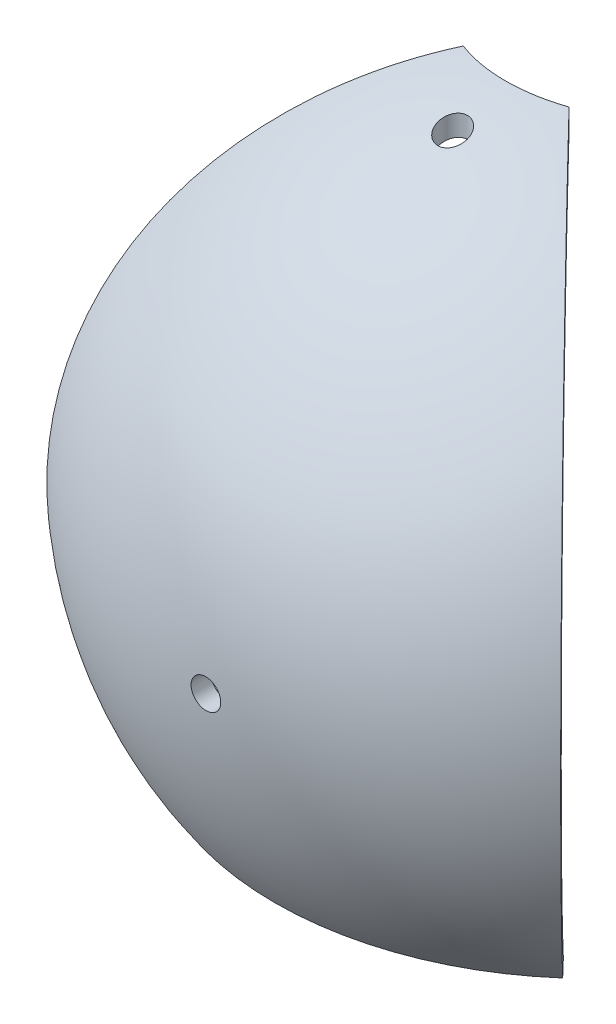
ISO-10303-21;
HEADER;
FILE_DESCRIPTION(('STEP AP214'),'2;1');
FILE_NAME('part.step','',(''),(''),'','','');
FILE_SCHEMA(('AUTOMOTIVE_DESIGN { 1 0 10303 214 1 1 1 1 }'));
ENDSEC;
DATA;
#1=APPLICATION_CONTEXT('core data for automotive mechanical design processes');
#2=APPLICATION_PROTOCOL_DEFINITION('international standard','automotive_design',2000,#1);
#3=PRODUCT_CONTEXT('',#1,'mechanical');
#4=PRODUCT('Part','Part','',(#3));
#5=PRODUCT_RELATED_PRODUCT_CATEGORY('part','',(#4));
#6=PRODUCT_DEFINITION_FORMATION('','',#4);
#7=PRODUCT_DEFINITION_CONTEXT('part definition',#1,'design');
#8=PRODUCT_DEFINITION('design','',#6,#7);
#9=PRODUCT_DEFINITION_SHAPE('','',#8);
#10=(LENGTH_UNIT() NAMED_UNIT(*) SI_UNIT(.MILLI.,.METRE.));
#11=(NAMED_UNIT(*) PLANE_ANGLE_UNIT() SI_UNIT($,.RADIAN.));
#12=(NAMED_UNIT(*) SI_UNIT($,.STERADIAN.) SOLID_ANGLE_UNIT());
#13=UNCERTAINTY_MEASURE_WITH_UNIT(LENGTH_MEASURE(1.E-05),#10,'distance_accuracy_value','');
#14=(GEOMETRIC_REPRESENTATION_CONTEXT(3) GLOBAL_UNCERTAINTY_ASSIGNED_CONTEXT((#13)) GLOBAL_UNIT_ASSIGNED_CONTEXT((#10,
#11,#12)) REPRESENTATION_CONTEXT('',''));
#15=CARTESIAN_POINT('',(0.,0.,0.));
#16=DIRECTION('',(0.,0.,1.));
#17=DIRECTION('',(1.,0.,0.));
#18=AXIS2_PLACEMENT_3D('',#15,#16,#17);
#19=CARTESIAN_POINT('',(0.,0.,0.));
#20=DIRECTION('',(0.,1.,0.));
#21=DIRECTION('',(1.,0.,0.));
#22=AXIS2_PLACEMENT_3D('',#19,#20,#21);
#23=SPHERICAL_SURFACE('',#22,39.);
#24=CARTESIAN_POINT('',(-0.829317384446339,-1.74989275082327,38.9518945311625));
#25=CARTESIAN_POINT('',(-0.759113662667595,-1.7964691191582,38.9512965972717));
#26=CARTESIAN_POINT('',(-0.684925455090101,-1.83715175361978,38.9507745988475));
#27=CARTESIAN_POINT('',(-0.530708817745456,-1.90551726469634,38.9498971700714));
#28=CARTESIAN_POINT('',(-0.450673467904894,-1.93318443990475,38.9495419409053));
#29=CARTESIAN_POINT('',(-0.287123645697143,-1.97467653061984,38.9490092526865));
#30=CARTESIAN_POINT('',(-0.203610844476173,-1.98850801692015,38.9488317092478));
#31=CARTESIAN_POINT('',(-0.0354711783529405,-2.00195010621267,38.9486591601945));
#32=CARTESIAN_POINT('',(0.0491554048302957,-2.00156423876038,38.9486641092748));
#33=CARTESIAN_POINT('',(0.217149879164021,-1.98659263391192,38.9488563021904));
#34=CARTESIAN_POINT('',(0.300517673022089,-1.97200580456416,38.9490435600441));
#35=CARTESIAN_POINT('',(0.463624042350791,-1.92904356400015,38.9495950755504));
#36=CARTESIAN_POINT('',(0.543362475604774,-1.90066761296442,38.9499593401326));
#37=CARTESIAN_POINT('',(0.696942919628291,-1.8309331130855,38.9508545102239));
#38=CARTESIAN_POINT('',(0.770784967717642,-1.78957464642033,38.9513854146783));
#39=CARTESIAN_POINT('',(0.910477302840745,-1.6950495057598,38.9525987690921));
#40=CARTESIAN_POINT('',(0.976327603636761,-1.64188285209927,38.9532812187906));
#41=CARTESIAN_POINT('',(1.09817172173922,-1.5252471737738,38.95477831261));
#42=CARTESIAN_POINT('',(1.15416493660856,-1.46177751987408,38.9555929648049));
#43=CARTESIAN_POINT('',(1.25470102366707,-1.32634014555662,38.9573312819483));
#44=CARTESIAN_POINT('',(1.29924391161336,-1.2543724368335,38.9582549467467));
#45=CARTESIAN_POINT('',(1.3756188186184,-1.1039755945865,38.960185129638));
#46=CARTESIAN_POINT('',(1.40744981372504,-1.02554594116191,38.9611916543974));
#47=CARTESIAN_POINT('',(1.45749272999841,-0.864456430275049,38.9632589068215));
#48=CARTESIAN_POINT('',(1.47570463124064,-0.78179656662424,38.9643196345655));
#49=CARTESIAN_POINT('',(1.49799336616795,-0.61458736372391,38.966465246246));
#50=CARTESIAN_POINT('',(1.50206927195666,-0.530037900806416,38.9675501317635));
#51=CARTESIAN_POINT('',(1.49596777940234,-0.361454778340608,38.9697131936351));
#52=CARTESIAN_POINT('',(1.48579038391762,-0.277421118688859,38.9707913699906));
#53=CARTESIAN_POINT('',(1.45147064891636,-0.112253046204455,38.9729104388805));
#54=CARTESIAN_POINT('',(1.42732798814376,-0.0311187001130125,38.9739513305568));
#55=CARTESIAN_POINT('',(1.36576251642206,0.125945368268407,38.9759662662382));
#56=CARTESIAN_POINT('',(1.32833970489738,0.201875090332812,38.9769403102403));
#57=CARTESIAN_POINT('',(1.24127725272952,0.346371883209455,38.9787938851804));
#58=CARTESIAN_POINT('',(1.19163798184242,0.414939176770419,38.9796734189779));
#59=CARTESIAN_POINT('',(1.08155083962351,0.542766772028414,38.9813130544399));
#60=CARTESIAN_POINT('',(1.02110297245977,0.602027077314427,38.9820731561505));
#61=CARTESIAN_POINT('',(0.891119045328867,0.709553973550744,38.9834523156998));
#62=CARTESIAN_POINT('',(0.821583622144255,0.757821334148481,38.9840713834126));
#63=CARTESIAN_POINT('',(0.675395145603105,0.841996845823652,38.9851509826645));
#64=CARTESIAN_POINT('',(0.598742095089817,0.877905001838139,38.9856115142669));
#65=CARTESIAN_POINT('',(0.440500838918119,0.936339856762202,38.9863609483892));
#66=CARTESIAN_POINT('',(0.35891302415653,0.95886761404594,38.9866498644838));
#67=CARTESIAN_POINT('',(0.193112947691494,0.989906254260217,38.9870479300126));
#68=CARTESIAN_POINT('',(0.108900687259288,0.998417143980205,38.9871570795339));
#69=CARTESIAN_POINT('',(-0.0597529230804632,1.00118024521994,38.9871925155631));
#70=CARTESIAN_POINT('',(-0.144194260432133,0.995433223060434,38.9871188118989));
#71=CARTESIAN_POINT('',(-0.310913492189501,0.969845336114689,38.9867906522879));
#72=CARTESIAN_POINT('',(-0.393191385953802,0.950004467150089,38.9865361962876));
#73=CARTESIAN_POINT('',(-0.553247795669495,0.896792483018353,38.9858537497718));
#74=CARTESIAN_POINT('',(-0.631026330878122,0.86342142576526,38.9854257599991));
#75=CARTESIAN_POINT('',(-0.779876741266382,0.784096755666778,38.9844083835567));
#76=CARTESIAN_POINT('',(-0.850948622283326,0.738143153773069,38.9838189970276));
#77=CARTESIAN_POINT('',(-0.984371928218104,0.634955764713508,38.9824955101811));
#78=CARTESIAN_POINT('',(-1.0467229515231,0.577721458341001,38.9817614032029));
#79=CARTESIAN_POINT('',(-1.16093142914819,0.453598835335737,38.9801693104379));
#80=CARTESIAN_POINT('',(-1.21278886041956,0.386710497498862,38.9793113243789));
#81=CARTESIAN_POINT('',(-1.30454212809818,0.245173289505732,38.9774957393664));
#82=CARTESIAN_POINT('',(-1.34443706462224,0.170523836085196,38.9765381329262));
#83=CARTESIAN_POINT('',(-1.41112822365136,0.0155874327516109,38.9745505223784));
#84=CARTESIAN_POINT('',(-1.43792441403325,-0.0646995309862279,38.9735205180932));
#85=CARTESIAN_POINT('',(-1.47765964571755,-0.228639595189733,38.9714172376562));
#86=CARTESIAN_POINT('',(-1.49059740226104,-0.312293006999318,38.970343957502));
#87=CARTESIAN_POINT('',(-1.50224387312748,-0.48058118497398,38.968184714985));
#88=CARTESIAN_POINT('',(-1.50095314230701,-0.565215912742917,38.9670987531182));
#89=CARTESIAN_POINT('',(-1.48418178002425,-0.733061634951191,38.9649450087684));
#90=CARTESIAN_POINT('',(-1.46870208629033,-0.816272723106649,38.9638772250888));
#91=CARTESIAN_POINT('',(-1.42398537187875,-0.978937481310493,38.9617897890118));
#92=CARTESIAN_POINT('',(-1.39474493201641,-1.05839021210282,38.9607701486462));
#93=CARTESIAN_POINT('',(-1.32332721513536,-1.21128841156768,38.9588078966232));
#94=CARTESIAN_POINT('',(-1.28114394607499,-1.28473107781629,38.9578653209004));
#95=CARTESIAN_POINT('',(-1.18506981383644,-1.42342281433127,38.956085241798));
#96=CARTESIAN_POINT('',(-1.13119309955581,-1.48868163766003,38.955247613349));
#97=CARTESIAN_POINT('',(-1.03544664427015,-1.58656832111288,38.9539912380819));
#98=CARTESIAN_POINT('',(-0.996651447364394,-1.62225534180965,38.9535332076529));
#99=CARTESIAN_POINT('',(-0.915528938893831,-1.68936014749848,38.9526717379846));
#100=CARTESIAN_POINT('',(-0.873201626912583,-1.72077793198719,38.9522682987517));
#101=CARTESIAN_POINT('',(-0.829317384446339,-1.74989275082327,38.9518945311625));
#102=B_SPLINE_CURVE_WITH_KNOTS('',3,(#24,#25,#26,#27,#28,#29,#30,#31,#32,#33,#34,#35,#36,#37,
#38,#39,#40,#41,#42,#43,#44,#45,#46,#47,#48,#49,#50,#51,#52,#53,#54,#55,#56,#57,#58,#59,#60,#61,
#62,#63,#64,#65,#66,#67,#68,#69,#70,#71,#72,#73,#74,#75,#76,#77,#78,#79,#80,#81,#82,#83,#84,#85,
#86,#87,#88,#89,#90,#91,#92,#93,#94,#95,#96,#97,#98,#99,#100,#101),.UNSPECIFIED.,.T.,.F.,(4,2,2,
2,2,2,2,2,2,2,2,2,2,2,2,2,2,2,2,2,2,2,2,2,2,2,2,2,2,2,2,2,2,2,2,2,2,2,4),(0.,0.25256159699522,
0.5054270992835,0.758172454536491,1.01085506444582,1.26355710536095,1.51626903990663,
1.76897937484332,2.02168927459163,2.27441461389333,2.52713960541053,2.77988495000335,
3.03263066435732,3.28539296879802,3.53815522255051,3.79092329106083,4.04369137052627,
4.29645180039056,4.54921213278455,4.80195476326245,5.05469729277874,5.30741982798813,
5.56014224078451,5.81285107079031,6.06555997571602,6.31826779896867,6.57097540226845,
6.8236946394269,7.0764144316664,7.32915323008112,7.58189264830538,7.83465549494382,
8.08740848483296,8.34014477184077,8.59294389037399,8.84586022241016,9.09847221870165,
9.25634808016043,9.41422396023315),.UNSPECIFIED.);
#103=CARTESIAN_POINT('',(-0.829317384446339,-1.74989275082327,38.9518945311625));
#104=VERTEX_POINT('',#103);
#105=EDGE_CURVE('E97',#104,#104,#102,.T.);
#106=ORIENTED_EDGE('',*,*,#105,.F.);
#107=EDGE_LOOP('',(#106));
#108=FACE_BOUND('',#107,.T.);
#109=CARTESIAN_POINT('',(-5.34808023640383,37.8830921170535,7.56765283531336));
#110=CARTESIAN_POINT('',(-4.99209576801475,37.9036155476832,7.71656461083798));
#111=CARTESIAN_POINT('',(-4.62976325002011,37.9220698612105,7.85057549590869));
#112=CARTESIAN_POINT('',(-3.89501451804352,37.954742893749,8.08797682705822));
#113=CARTESIAN_POINT('',(-3.52259827120587,37.9689615989576,8.19136717335339));
#114=CARTESIAN_POINT('',(-2.77010534819923,37.9930720550301,8.36675241885814));
#115=CARTESIAN_POINT('',(-2.39002486877698,38.0029615994443,8.43873130848632));
#116=CARTESIAN_POINT('',(-1.62511210631183,38.0183403517788,8.55068671495762));
#117=CARTESIAN_POINT('',(-1.24028007576623,38.0238297925073,8.59066492494714));
#118=CARTESIAN_POINT('',(-0.468275058208203,38.0303759177944,8.63834065389105));
#119=CARTESIAN_POINT('',(-0.0811004461248224,38.0314290562428,8.64601234898124));
#120=CARTESIAN_POINT('',(0.692520557457719,38.0290860414442,8.62894665418871));
#121=CARTESIAN_POINT('',(1.07896695183712,38.0256899058321,8.60420939276008));
#122=CARTESIAN_POINT('',(1.84772963948812,38.0144800364282,8.52258255975344));
#123=CARTESIAN_POINT('',(2.23005170848019,38.0066736213385,8.46574625544929));
#124=CARTESIAN_POINT('',(2.9883602406237,37.9867021161635,8.32040937417763));
#125=CARTESIAN_POINT('',(3.3643494866971,37.9745389958542,8.23192310697918));
#126=CARTESIAN_POINT('',(4.01028166406886,37.9496751232212,8.05115693329916));
#127=CARTESIAN_POINT('',(4.2822546207514,37.9379459487579,7.96591447783717));
#128=CARTESIAN_POINT('',(4.81997787484041,37.9122137786293,7.77900955907756));
#129=CARTESIAN_POINT('',(5.08573605039015,37.8982138627542,7.67736933693509));
#130=CARTESIAN_POINT('',(5.34808023640385,37.8830921170535,7.56765283531337));
#131=B_SPLINE_CURVE_WITH_KNOTS('',3,(#109,#110,#111,#112,#113,#114,#115,#116,#117,#118,#119,
#120,#121,#122,#123,#124,#125,#126,#127,#128,#129,#130),.UNSPECIFIED.,.F.,.F.,(4,2,2,2,2,2,2,2,
2,2,4),(0.,1.15891553536544,2.31783484726638,3.47734414152722,4.63679208244159,5.79716663984775,
6.95753659808005,8.1159865960024,9.27391348932759,10.1291691514563,10.9832743899857),.UNSPECIFIED.);
#132=CARTESIAN_POINT('',(-5.34788023640383,37.88310364409,7.56773646926302));
#133=VERTEX_POINT('',#132);
#134=CARTESIAN_POINT('',(5.34788023640385,37.88310364409,7.56773646926302));
#135=VERTEX_POINT('',#134);
#136=EDGE_CURVE('E127',#133,#135,#131,.T.);
#137=ORIENTED_EDGE('',*,*,#136,.F.);
#138=CARTESIAN_POINT('',(0.999188973849464,0.,0.959733456348281));
#139=DIRECTION('',(0.721202656557683,0.,0.692724135694824));
#140=DIRECTION('',(0.692724135694824,0.,-0.721202656557683));
#141=AXIS2_PLACEMENT_3D('',#138,#139,#140);
#142=CIRCLE('',#141,38.9753836810788);
#143=CARTESIAN_POINT('',(-21.1218911748245,-22.3457940451349,23.9902313805283));
#144=VERTEX_POINT('',#143);
#145=EDGE_CURVE('E95',#144,#133,#142,.F.);
#146=ORIENTED_EDGE('',*,*,#145,.F.);
#147=CARTESIAN_POINT('',(0.,-22.3457940451349,0.));
#148=DIRECTION('',(0.,1.,0.));
#149=DIRECTION('',(0.,0.,1.));
#150=AXIS2_PLACEMENT_3D('',#147,#148,#149);
#151=CIRCLE('',#150,31.9635024440754);
#152=CARTESIAN_POINT('',(21.1218911748245,-22.3457940451349,23.9902313805283));
#153=VERTEX_POINT('',#152);
#154=EDGE_CURVE('E103',#153,#144,#151,.F.);
#155=ORIENTED_EDGE('',*,*,#154,.F.);
#156=CARTESIAN_POINT('',(-0.999188973849462,0.,0.959733456348281));
#157=DIRECTION('',(-0.721202656557683,0.,0.692724135694824));
#158=DIRECTION('',(0.692724135694824,0.,0.721202656557683));
#159=AXIS2_PLACEMENT_3D('',#156,#157,#158);
#160=CIRCLE('',#159,38.9753836810788);
#161=EDGE_CURVE('E102',#135,#153,#160,.F.);
#162=ORIENTED_EDGE('',*,*,#161,.F.);
#163=EDGE_LOOP('',(#137,#146,#155,#162));
#164=FACE_BOUND('',#163,.T.);
#165=CARTESIAN_POINT('',(-1.09821011424549,36.7608279432137,12.9782688063607));
#166=CARTESIAN_POINT('',(-1.1585477013351,36.7361264499438,13.0431291960257));
#167=CARTESIAN_POINT('',(-1.21282320230994,36.7094825861257,13.1130241791469));
#168=CARTESIAN_POINT('',(-1.30797510793182,36.6532141287234,13.2604531572975));
#169=CARTESIAN_POINT('',(-1.34882359292493,36.6235834895278,13.3380026391312));
#170=CARTESIAN_POINT('',(-1.41618619112697,36.5623426829835,13.4980725445507));
#171=CARTESIAN_POINT('',(-1.44274006435421,36.5307382821053,13.580578462958));
#172=CARTESIAN_POINT('',(-1.48125930009085,36.46635375337,13.7484314365112));
#173=CARTESIAN_POINT('',(-1.49322961369824,36.4335740284267,13.8337775173112));
#174=CARTESIAN_POINT('',(-1.50262445947741,36.3663660096896,14.0085212694298));
#175=CARTESIAN_POINT('',(-1.49945619738421,36.3319237152425,14.0979458938448));
#176=CARTESIAN_POINT('',(-1.47726503416114,36.2636124533233,14.2750563991479));
#177=CARTESIAN_POINT('',(-1.45823835405796,36.2297436244679,14.3627418605037));
#178=CARTESIAN_POINT('',(-1.40436891368239,36.1632173961633,14.5347437605721));
#179=CARTESIAN_POINT('',(-1.36936643833511,36.1305759227242,14.6190165885089));
#180=CARTESIAN_POINT('',(-1.28414653552131,36.0679186965765,14.7805793884547));
#181=CARTESIAN_POINT('',(-1.23393121429389,36.0379025811245,14.8578703251942));
#182=CARTESIAN_POINT('',(-1.1214157383753,35.982574895057,15.0001801209765));
#183=CARTESIAN_POINT('',(-1.05960849295546,35.9571340400349,15.0655374988188));
#184=CARTESIAN_POINT('',(-0.924345053333521,35.9106767408605,15.1847798865488));
#185=CARTESIAN_POINT('',(-0.850894003897696,35.8896583521609,15.238669938709));
#186=CARTESIAN_POINT('',(-0.699691363958714,35.8541917856145,15.3295437878726));
#187=CARTESIAN_POINT('',(-0.622555486906752,35.8393983253171,15.3674169205516));
#188=CARTESIAN_POINT('',(-0.462219950762101,35.8151023489608,15.4295926000816));
#189=CARTESIAN_POINT('',(-0.37902309714072,35.8055974023616,15.4539013809682));
#190=CARTESIAN_POINT('',(-0.214763859444422,35.7927500502103,15.4867529446975));
#191=CARTESIAN_POINT('',(-0.133912529929307,35.7890482115222,15.4962153216986));
#192=CARTESIAN_POINT('',(0.0283191857594785,35.7868143295899,15.5019257769735));
#193=CARTESIAN_POINT('',(0.109699448916448,35.7882811243725,15.4981768253187));
#194=CARTESIAN_POINT('',(0.268073890048196,35.7961952140798,15.4779436642021));
#195=CARTESIAN_POINT('',(0.345126196383646,35.8024897440379,15.4618500768583));
#196=CARTESIAN_POINT('',(0.495305032214105,35.8196230799865,15.4180241131137));
#197=CARTESIAN_POINT('',(0.568431445932386,35.8304620199113,15.3902913936809));
#198=CARTESIAN_POINT('',(0.710023567880706,35.8564858381772,15.3236640849627));
#199=CARTESIAN_POINT('',(0.778396315920853,35.8717372873039,15.2845984920951));
#200=CARTESIAN_POINT('',(0.907587008829959,35.9059772945398,15.1968245331666));
#201=CARTESIAN_POINT('',(0.968403390008561,35.9249666240598,15.1481141766402));
#202=CARTESIAN_POINT('',(1.08421576605906,35.9671701760523,15.0397548834433));
#203=CARTESIAN_POINT('',(1.13873702704242,35.9905541467843,14.9796651964129));
#204=CARTESIAN_POINT('',(1.23699178313789,36.0400834954129,14.8522498189818));
#205=CARTESIAN_POINT('',(1.28072208022934,36.0662296886536,14.7849219919457));
#206=CARTESIAN_POINT('',(1.35922024436367,36.1223974237663,14.6401158430628));
#207=CARTESIAN_POINT('',(1.39318938037623,36.1525612919977,14.5622595259594));
#208=CARTESIAN_POINT('',(1.44745765295428,36.2143823087922,14.4024810790878));
#209=CARTESIAN_POINT('',(1.46775275332597,36.2460398953114,14.3205577565077));
#210=CARTESIAN_POINT('',(1.49509219533273,36.3117995633756,14.150155387127));
#211=CARTESIAN_POINT('',(1.50134597543642,36.3459403026514,14.0615636534082));
#212=CARTESIAN_POINT('',(1.49817059550795,36.4140478083303,13.8845815268106));
#213=CARTESIAN_POINT('',(1.48873851544071,36.4480145411602,13.7961911744879));
#214=CARTESIAN_POINT('',(1.45397297711273,36.515503952274,13.6203261376665));
#215=CARTESIAN_POINT('',(1.42832998238736,36.5490047074414,13.5329037781905));
#216=CARTESIAN_POINT('',(1.3612866353319,36.6138567288796,13.3634481227764));
#217=CARTESIAN_POINT('',(1.31988729656237,36.6452081332589,13.2814144805956));
#218=CARTESIAN_POINT('',(1.22341140504734,36.7039723051847,13.1274735466322));
#219=CARTESIAN_POINT('',(1.16871382641613,36.731465606939,13.0553601429875));
#220=CARTESIAN_POINT('',(1.04637194504094,36.7824785531609,12.921425822031));
#221=CARTESIAN_POINT('',(0.978732368394064,36.8059996422974,12.8596011628868));
#222=CARTESIAN_POINT('',(0.836758046597895,36.8468710661794,12.7520887978781));
#223=CARTESIAN_POINT('',(0.763072928430198,36.8645079647005,12.7056528543691));
#224=CARTESIAN_POINT('',(0.607950163480173,36.8947608787686,12.6259589260823));
#225=CARTESIAN_POINT('',(0.526516061382249,36.9073791764648,12.5926949515379));
#226=CARTESIAN_POINT('',(0.364010148077032,36.9264070426436,12.5425195647039));
#227=CARTESIAN_POINT('',(0.283266609935011,36.9331703069178,12.5246767169856));
#228=CARTESIAN_POINT('',(0.119693504601896,36.941572228749,12.5025092710193));
#229=CARTESIAN_POINT('',(0.0368646382993606,36.9432125855588,12.4981801902961));
#230=CARTESIAN_POINT('',(-0.124991752258766,36.9413432910758,12.5031127196822));
#231=CARTESIAN_POINT('',(-0.204038726714392,36.938037152747,12.5118372665932));
#232=CARTESIAN_POINT('',(-0.359463508080895,36.9267699607485,12.5415604136145));
#233=CARTESIAN_POINT('',(-0.435840671279323,36.9188077925663,12.5625619524642));
#234=CARTESIAN_POINT('',(-0.584006832985511,36.8984975021487,12.6161066015432));
#235=CARTESIAN_POINT('',(-0.655784056593874,36.886138616051,12.6486780364135));
#236=CARTESIAN_POINT('',(-0.792707302050221,36.8574707863963,12.724180398549));
#237=CARTESIAN_POINT('',(-0.85786083465345,36.8411663893211,12.7670994019199));
#238=CARTESIAN_POINT('',(-0.951181152961558,36.8136661572374,12.8394312222576));
#239=CARTESIAN_POINT('',(-0.982267066790468,36.8037012652533,12.8656314836061));
#240=CARTESIAN_POINT('',(-1.042056754722,36.7829008427809,12.9202969128475));
#241=CARTESIAN_POINT('',(-1.07076074278844,36.7720653906658,12.9487618768556));
#242=CARTESIAN_POINT('',(-1.09821011424549,36.7608279432137,12.9782688063607));
#243=B_SPLINE_CURVE_WITH_KNOTS('',3,(#165,#166,#167,#168,#169,#170,#171,#172,#173,#174,#175,
#176,#177,#178,#179,#180,#181,#182,#183,#184,#185,#186,#187,#188,#189,#190,#191,#192,#193,#194,
#195,#196,#197,#198,#199,#200,#201,#202,#203,#204,#205,#206,#207,#208,#209,#210,#211,#212,#213,
#214,#215,#216,#217,#218,#219,#220,#221,#222,#223,#224,#225,#226,#227,#228,#229,#230,#231,#232,
#233,#234,#235,#236,#237,#238,#239,#240,#241,#242),.UNSPECIFIED.,.T.,.F.,(4,2,2,2,2,2,2,2,2,2,2,
2,2,2,2,2,2,2,2,2,2,2,2,2,2,2,2,2,2,2,2,2,2,2,2,2,2,2,4),(0.,0.275734864254667,0.55203950712168,
0.827571593342387,1.10301011071691,1.3893206122019,1.6756993594085,1.96500604911654,
2.25427270221292,2.53325904501368,2.81212246068895,3.07234434612733,3.33244653757398,
3.57569346728422,3.81888571554146,4.05468481346683,4.29049086142148,4.53005863606623,
4.76967590382188,5.02190326053655,5.2742052780648,5.54344458986632,5.81276333882505,
6.09690117851988,6.3810919184274,6.67088011445428,6.96064967238499,7.24296984511567,
7.52518711759938,7.79038735868602,8.05546686484226,8.30311613865533,8.5506832592266,
8.78834092655642,9.02605550523037,9.26435609767596,9.50238338891191,9.62783469982335,
9.7532747294577),.UNSPECIFIED.);
#244=CARTESIAN_POINT('',(-1.09821011424549,36.7608279432137,12.9782688063607));
#245=VERTEX_POINT('',#244);
#246=EDGE_CURVE('E126',#245,#245,#243,.T.);
#247=ORIENTED_EDGE('',*,*,#246,.F.);
#248=EDGE_LOOP('',(#247));
#249=FACE_BOUND('',#248,.T.);
#250=ADVANCED_FACE('F40',(#108,#164,#249),#23,.T.);
#251=CARTESIAN_POINT('',(0.,-100.,2.));
#252=DIRECTION('',(0.721202656557683,0.,0.692724135694824));
#253=DIRECTION('',(0.692724135694824,0.,-0.721202656557683));
#254=AXIS2_PLACEMENT_3D('',#251,#252,#253);
#255=PLANE('',#254);
#256=ORIENTED_EDGE('',*,*,#145,.T.);
#257=DIRECTION('',(0.,1.,0.));
#258=VECTOR('',#257,1.);
#259=CARTESIAN_POINT('',(-5.34788023640383,-100.,7.56773646926302));
#260=LINE('',#259,#258);
#261=CARTESIAN_POINT('',(-5.34788023640383,35.8207976140798,7.56773646926302));
#262=VERTEX_POINT('',#261);
#263=EDGE_CURVE('E87',#262,#133,#260,.T.);
#264=ORIENTED_EDGE('',*,*,#263,.F.);
#265=CARTESIAN_POINT('',(0.999188973849465,0.,0.95973345634828));
#266=DIRECTION('',(0.721202656557683,0.,0.692724135694824));
#267=DIRECTION('',(0.692724135694824,0.,-0.721202656557683));
#268=AXIS2_PLACEMENT_3D('',#265,#266,#267);
#269=CIRCLE('',#268,36.9740521594172);
#270=CARTESIAN_POINT('',(-19.4067524222632,-22.3457940451349,22.2045817099398));
#271=VERTEX_POINT('',#270);
#272=EDGE_CURVE('E69',#262,#271,#269,.T.);
#273=ORIENTED_EDGE('',*,*,#272,.T.);
#274=DIRECTION('',(-0.692724135694824,0.,0.721202656557683));
#275=VECTOR('',#274,1.);
#276=CARTESIAN_POINT('',(0.,-22.3457940451349,2.));
#277=LINE('',#276,#275);
#278=EDGE_CURVE('E108',#271,#144,#277,.T.);
#279=ORIENTED_EDGE('',*,*,#278,.T.);
#280=EDGE_LOOP('',(#256,#264,#273,#279));
#281=FACE_BOUND('',#280,.T.);
#282=ADVANCED_FACE('F93',(#281),#255,.F.);
#283=CARTESIAN_POINT('',(0.,-100.,2.));
#284=DIRECTION('',(-0.721202656557683,0.,0.692724135694824));
#285=DIRECTION('',(0.692724135694824,0.,0.721202656557683));
#286=AXIS2_PLACEMENT_3D('',#283,#284,#285);
#287=PLANE('',#286);
#288=CARTESIAN_POINT('',(-0.999188973849461,0.,0.959733456348283));
#289=DIRECTION('',(-0.721202656557683,0.,0.692724135694824));
#290=DIRECTION('',(0.692724135694824,0.,0.721202656557683));
#291=AXIS2_PLACEMENT_3D('',#288,#289,#290);
#292=CIRCLE('',#291,36.9740521594172);
#293=CARTESIAN_POINT('',(19.4067524222633,-22.3457940451349,22.2045817099398));
#294=VERTEX_POINT('',#293);
#295=CARTESIAN_POINT('',(5.34788023640385,35.8207976140798,7.56773646926302));
#296=VERTEX_POINT('',#295);
#297=EDGE_CURVE('E114',#294,#296,#292,.T.);
#298=ORIENTED_EDGE('',*,*,#297,.T.);
#299=DIRECTION('',(0.,1.,0.));
#300=VECTOR('',#299,1.);
#301=CARTESIAN_POINT('',(5.34788023640385,-100.,7.56773646926302));
#302=LINE('',#301,#300);
#303=EDGE_CURVE('E62',#296,#135,#302,.T.);
#304=ORIENTED_EDGE('',*,*,#303,.T.);
#305=ORIENTED_EDGE('',*,*,#161,.T.);
#306=DIRECTION('',(-0.692724135694824,0.,-0.721202656557683));
#307=VECTOR('',#306,1.);
#308=CARTESIAN_POINT('',(0.,-22.3457940451349,2.));
#309=LINE('',#308,#307);
#310=EDGE_CURVE('E151',#153,#294,#309,.T.);
#311=ORIENTED_EDGE('',*,*,#310,.T.);
#312=EDGE_LOOP('',(#298,#304,#305,#311));
#313=FACE_BOUND('',#312,.T.);
#314=ADVANCED_FACE('F188',(#313),#287,.F.);
#315=CARTESIAN_POINT('',(0.,0.,0.));
#316=DIRECTION('',(0.,1.,0.));
#317=DIRECTION('',(-1.,0.,0.));
#318=AXIS2_PLACEMENT_3D('',#315,#316,#317);
#319=SPHERICAL_SURFACE('',#318,37.);
#320=CARTESIAN_POINT('',(-0.829388098536456,-1.74984614333368,36.9492916556822));
#321=CARTESIAN_POINT('',(-0.7591876577591,-1.79642612279681,36.9486613326942));
#322=CARTESIAN_POINT('',(-0.685002252912372,-1.83711247244397,36.9481107467836));
#323=CARTESIAN_POINT('',(-0.530790610819441,-1.90548624796585,36.9471854677154));
#324=CARTESIAN_POINT('',(-0.450757452273586,-1.9331579723037,36.9468109870205));
#325=CARTESIAN_POINT('',(-0.287211123366007,-1.97465948861808,36.9462493439616));
#326=CARTESIAN_POINT('',(-0.203699624006595,-1.9884958490329,36.9460620927091));
#327=CARTESIAN_POINT('',(-0.0355617208306168,-2.001947932202,36.9458800419979));
#328=CARTESIAN_POINT('',(0.0490644009216715,-2.00156718612958,36.945885194751));
#329=CARTESIAN_POINT('',(0.217058553488988,-1.98660593019374,36.9460876694739));
#330=CARTESIAN_POINT('',(0.300426490946389,-1.97202437183545,36.9462850056334));
#331=CARTESIAN_POINT('',(0.463534016226137,-1.92907272124866,36.9468662726135));
#332=CARTESIAN_POINT('',(0.543273461675449,-1.90070208848036,36.9472502107491));
#333=CARTESIAN_POINT('',(0.696856894938691,-1.83097810850547,36.9481937598099));
#334=CARTESIAN_POINT('',(0.77070091218104,-1.78962482610992,36.9487533698581));
#335=CARTESIAN_POINT('',(0.910398023091589,-1.69510984178225,36.9500323486752));
#336=CARTESIAN_POINT('',(0.976251130443211,-1.64194816007097,36.9507517171705));
#337=CARTESIAN_POINT('',(1.09810209729389,-1.52532170928278,36.9523298171017));
#338=CARTESIAN_POINT('',(1.15409928940686,-1.46185624305161,36.9531885579675));
#339=CARTESIAN_POINT('',(1.25464399435274,-1.32642667442622,36.9550209601653));
#340=CARTESIAN_POINT('',(1.29919152232279,-1.25446258326786,36.9559946213455));
#341=CARTESIAN_POINT('',(1.37557666002132,-1.10407161607189,36.9580292956441));
#342=CARTESIAN_POINT('',(1.40741313244008,-1.02564416248807,36.9590903165688));
#343=CARTESIAN_POINT('',(1.45746728408821,-0.864558173496677,36.9612694995113));
#344=CARTESIAN_POINT('',(1.4756849428004,-0.781899631715032,36.9623876616153));
#345=CARTESIAN_POINT('',(1.4979854271952,-0.614691506168051,36.9646494609708));
#346=CARTESIAN_POINT('',(1.50206722118606,-0.530141784830117,36.9657931000756));
#347=CARTESIAN_POINT('',(1.49597728841815,-0.361557160548655,36.968073308493));
#348=CARTESIAN_POINT('',(1.48580556418784,-0.277522257513806,36.9692098778069));
#349=CARTESIAN_POINT('',(1.4514967325638,-0.112350528290613,36.9714437197127));
#350=CARTESIAN_POINT('',(1.42735926834289,-0.0312137762067918,36.9725409912998));
#351=CARTESIAN_POINT('',(1.36580354286414,0.12585595979468,36.9746650707144));
#352=CARTESIAN_POINT('',(1.32838528116066,0.201788943537712,36.9756918785394));
#353=CARTESIAN_POINT('',(1.24133126296862,0.346292734810149,36.9776458646396));
#354=CARTESIAN_POINT('',(1.19169591728872,0.414863789778633,36.9785730462632));
#355=CARTESIAN_POINT('',(1.08161575008,0.542699507539049,36.9803015166009));
#356=CARTESIAN_POINT('',(1.02117093312863,0.601964174271906,36.9811028053682));
#357=CARTESIAN_POINT('',(0.891192641200775,0.709499768691668,36.9825567031088));
#358=CARTESIAN_POINT('',(0.821659873852574,0.757771551531763,36.9832093236472));
#359=CARTESIAN_POINT('',(0.675475797431998,0.841956276870146,36.984347454089));
#360=CARTESIAN_POINT('',(0.598824491554946,0.877869224915948,36.9848329640674));
#361=CARTESIAN_POINT('',(0.440586488212222,0.93631357213076,36.985623068014));
#362=CARTESIAN_POINT('',(0.359000225194235,0.958846147353748,36.9859276778822));
#363=CARTESIAN_POINT('',(0.193202377987381,0.989894649162532,36.9863474095035));
#364=CARTESIAN_POINT('',(0.10899079517348,0.998410583089181,36.9864625313558));
#365=CARTESIAN_POINT('',(-0.0596618175645671,1.00118383149305,36.9865000213848));
#366=CARTESIAN_POINT('',(-0.14410283348858,0.995441997298789,36.98642240107));
#367=CARTESIAN_POINT('',(-0.310822285327019,0.969864586559046,36.9860766318717));
#368=CARTESIAN_POINT('',(-0.393100720626167,0.950029006003782,36.985808482934));
#369=CARTESIAN_POINT('',(-0.553159027028193,0.896827592065264,36.9850892620314));
#370=CARTESIAN_POINT('',(-0.630938919732926,0.863461823659694,36.984638190945));
#371=CARTESIAN_POINT('',(-0.77979290229559,0.784147612476253,36.9835659165161));
#372=CARTESIAN_POINT('',(-0.850866997856629,0.738199180399743,36.9829447133183));
#373=CARTESIAN_POINT('',(-0.984295932586161,0.635021630807511,36.9815497527592));
#374=CARTESIAN_POINT('',(-1.04665032530716,0.57779193605402,36.9807759875916));
#375=CARTESIAN_POINT('',(-1.16086628161254,0.453678080996152,36.979097863337));
#376=CARTESIAN_POINT('',(-1.21272782166471,0.386793899040326,36.9781935039572));
#377=CARTESIAN_POINT('',(-1.30449040615598,0.245263818559471,36.9762797578759));
#378=CARTESIAN_POINT('',(-1.34439044824953,0.170617270271842,36.9752703623822));
#379=CARTESIAN_POINT('',(-1.41109223781941,0.0156858810239663,36.9731752352912));
#380=CARTESIAN_POINT('',(-1.43789395264741,-0.0645989739895116,36.9720895035038));
#381=CARTESIAN_POINT('',(-1.47764071231518,-0.228536387285445,36.9698723941728));
#382=CARTESIAN_POINT('',(-1.49058435833922,-0.312189284649682,36.9687410120333));
#383=CARTESIAN_POINT('',(-1.50224254980819,-0.480477413904023,36.9664648551239));
#384=CARTESIAN_POINT('',(-1.50095764928519,-0.565112607417223,36.965320080877));
#385=CARTESIAN_POINT('',(-1.48419768267962,-0.73296061181197,36.9630496668832));
#386=CARTESIAN_POINT('',(-1.46872349291263,-0.81617351020969,36.9619240259588));
#387=CARTESIAN_POINT('',(-1.4240172600754,-0.978842801484995,36.9597234622969));
#388=CARTESIAN_POINT('',(-1.39478179866055,-1.05829825560156,36.9586485522341));
#389=CARTESIAN_POINT('',(-1.32337338582822,-1.211202590219,36.9565799078631));
#390=CARTESIAN_POINT('',(-1.281194462112,-1.28464867805556,36.9555862112965));
#391=CARTESIAN_POINT('',(-1.18512819920475,-1.42334797271765,36.9537095962532));
#392=CARTESIAN_POINT('',(-1.13125500867477,-1.48861093091319,36.9528265459265));
#393=CARTESIAN_POINT('',(-1.03551296893862,-1.58650515032587,36.9515019330658));
#394=CARTESIAN_POINT('',(-0.996718921517013,-1.62219540006085,36.9510189955453));
#395=CARTESIAN_POINT('',(-0.915598358045849,-1.68930684356456,36.9501108708044));
#396=CARTESIAN_POINT('',(-0.873271842047312,-1.72072803739495,36.9496856835833));
#397=CARTESIAN_POINT('',(-0.829388098536456,-1.74984614333368,36.9492916556822));
#398=B_SPLINE_CURVE_WITH_KNOTS('',3,(#320,#321,#322,#323,#324,#325,#326,#327,#328,#329,#330,
#331,#332,#333,#334,#335,#336,#337,#338,#339,#340,#341,#342,#343,#344,#345,#346,#347,#348,#349,
#350,#351,#352,#353,#354,#355,#356,#357,#358,#359,#360,#361,#362,#363,#364,#365,#366,#367,#368,
#369,#370,#371,#372,#373,#374,#375,#376,#377,#378,#379,#380,#381,#382,#383,#384,#385,#386,#387,
#388,#389,#390,#391,#392,#393,#394,#395,#396,#397),.UNSPECIFIED.,.T.,.F.,(4,2,2,2,2,2,2,2,2,2,2,
2,2,2,2,2,2,2,2,2,2,2,2,2,2,2,2,2,2,2,2,2,2,2,2,2,2,2,4),(0.,0.252560116338235,
0.505424157951098,0.758168093466311,1.0108492541333,1.26354907253496,1.51625879771657,
1.76896726135913,2.02167529226432,2.27440042853122,2.52712523067889,2.77987264007557,
3.03262043024363,3.28538666656431,3.53815285804659,3.79092550803601,4.04369816650748,
4.2964623264687,4.549226379393,4.80197076269453,5.05471503254646,5.30743708441386,
5.56015900392462,5.81286583382221,6.06557273561687,6.31827842382049,6.57098389710248,
6.823702304134,7.07642127792836,7.32916142306577,7.58190219816919,7.83466848219866,
8.08742492403277,8.34016575694578,8.59296940466145,8.84588987543834,9.09850603158694,
9.25638657199116,9.41426711011499),.UNSPECIFIED.);
#399=CARTESIAN_POINT('',(-0.829388098536456,-1.74984614333368,36.9492916556822));
#400=VERTEX_POINT('',#399);
#401=EDGE_CURVE('E44',#400,#400,#398,.T.);
#402=ORIENTED_EDGE('',*,*,#401,.T.);
#403=EDGE_LOOP('',(#402));
#404=FACE_BOUND('',#403,.T.);
#405=CARTESIAN_POINT('',(-1.06367395949294,34.6462675267502,12.9423620228684));
#406=CARTESIAN_POINT('',(-1.1262685006103,34.6208271261241,13.0053199447858));
#407=CARTESIAN_POINT('',(-1.1829003980199,34.5932528281321,13.0734895311705));
#408=CARTESIAN_POINT('',(-1.28292852248326,34.5348002834835,13.2178010605098));
#409=CARTESIAN_POINT('',(-1.32629561472855,34.5039149624507,13.2939600660123));
#410=CARTESIAN_POINT('',(-1.39882196738771,34.4399114248323,13.4515542751405));
#411=CARTESIAN_POINT('',(-1.42802583562748,34.4068005977242,13.5329719859238));
#412=CARTESIAN_POINT('',(-1.47199663047796,34.3391786730989,13.6989982659238));
#413=CARTESIAN_POINT('',(-1.48676865721445,34.3046680747461,13.7836056969265));
#414=CARTESIAN_POINT('',(-1.50207667709185,34.2334651719241,13.9578995461384));
#415=CARTESIAN_POINT('',(-1.50190973942373,34.1967466433606,14.047637556635));
#416=CARTESIAN_POINT('',(-1.48559881509001,34.123711376632,14.2258448709867));
#417=CARTESIAN_POINT('',(-1.4694502135052,34.0873947575867,14.3143138008918));
#418=CARTESIAN_POINT('',(-1.42101781942522,34.015604325519,14.4889275601996));
#419=CARTESIAN_POINT('',(-1.38847256684275,33.9801542570732,14.5750100819525));
#420=CARTESIAN_POINT('',(-1.30766356521679,33.9118585887178,14.7406076278453));
#421=CARTESIAN_POINT('',(-1.25940163589097,33.8790126878382,14.8201234109638));
#422=CARTESIAN_POINT('',(-1.15008786124354,33.8181977475433,14.9671569519986));
#423=CARTESIAN_POINT('',(-1.08954573813212,33.7900977845656,15.0349984059205));
#424=CARTESIAN_POINT('',(-0.956113621808396,33.7385261396577,15.1593757176219));
#425=CARTESIAN_POINT('',(-0.883229685094552,33.7150521997663,15.2159170911605));
#426=CARTESIAN_POINT('',(-0.732903084353082,33.6753110870469,15.3115639455118));
#427=CARTESIAN_POINT('',(-0.656187867323294,33.6586413629215,15.3516447024803));
#428=CARTESIAN_POINT('',(-0.496131304708417,33.6309378817498,15.418221817434));
#429=CARTESIAN_POINT('',(-0.412793596489496,33.6199010552566,15.4447255737514));
#430=CARTESIAN_POINT('',(-0.248616036214481,33.6045992730385,15.4814629252334));
#431=CARTESIAN_POINT('',(-0.168055517443223,33.5998895867455,15.4927651094024));
#432=CARTESIAN_POINT('',(-0.00604256372727034,33.5959669317147,15.5021789403262));
#433=CARTESIAN_POINT('',(0.0754096199836058,33.5967524525309,15.5002942117156));
#434=CARTESIAN_POINT('',(0.233626888058436,33.6036467895006,15.4837476061496));
#435=CARTESIAN_POINT('',(0.310452595292324,33.6095526540211,15.4695728593582));
#436=CARTESIAN_POINT('',(0.460490169104187,33.6261672571142,15.429676570075));
#437=CARTESIAN_POINT('',(0.533701976966944,33.636876073692,15.4039548400472));
#438=CARTESIAN_POINT('',(0.675657137153065,33.662865738078,15.341487161262));
#439=CARTESIAN_POINT('',(0.744321529292862,33.6782098347009,15.3045886846424));
#440=CARTESIAN_POINT('',(0.874437072713458,33.7128555924902,15.2212023974154));
#441=CARTESIAN_POINT('',(0.935886661395795,33.7321581085027,15.1747125154691));
#442=CARTESIAN_POINT('',(1.05359752564872,33.775291326596,15.0707209137886));
#443=CARTESIAN_POINT('',(1.10936748909817,33.7993166407163,15.0127444805857));
#444=CARTESIAN_POINT('',(1.21045906797984,33.850341248713,14.8894660095293));
#445=CARTESIAN_POINT('',(1.25577733618541,33.8773414912508,14.8241616347787));
#446=CARTESIAN_POINT('',(1.33823921265748,33.935686903574,14.6828595102641));
#447=CARTESIAN_POINT('',(1.37451527257505,33.9672060573255,14.6064271225128));
#448=CARTESIAN_POINT('',(1.43362192630908,34.0319441880631,14.4492079829744));
#449=CARTESIAN_POINT('',(1.45644809523127,34.0651637205565,14.3684198077024));
#450=CARTESIAN_POINT('',(1.48935596613936,34.1346136278794,14.1992654430317));
#451=CARTESIAN_POINT('',(1.49852969214851,34.1709007216149,14.1107449639044));
#452=CARTESIAN_POINT('',(1.50114472030343,34.2434613589186,13.9334525560166));
#453=CARTESIAN_POINT('',(1.49458246710924,34.2797348975723,13.8446805749586));
#454=CARTESIAN_POINT('',(1.46540562727845,34.3522331055273,13.6669795834964));
#455=CARTESIAN_POINT('',(1.44237415835252,34.3884314935003,13.5781076292137));
#456=CARTESIAN_POINT('',(1.38013305044221,34.4587106417455,13.4053034388647));
#457=CARTESIAN_POINT('',(1.34092405006666,34.4927914855469,13.3213710079598));
#458=CARTESIAN_POINT('',(1.24818864841783,34.5569266439676,13.1632080420936));
#459=CARTESIAN_POINT('',(1.19503812551173,34.5870593785372,13.0887896527355));
#460=CARTESIAN_POINT('',(1.07513485158442,34.6431892969593,12.9500079962421));
#461=CARTESIAN_POINT('',(1.00838750420638,34.6691881164245,12.8856407524823));
#462=CARTESIAN_POINT('',(0.86780909130005,34.7144678855927,12.7734357093721));
#463=CARTESIAN_POINT('',(0.794728403124511,34.7340773208181,12.7247913671179));
#464=CARTESIAN_POINT('',(0.640233401707983,34.7679739347778,12.6406527631585));
#465=CARTESIAN_POINT('',(0.558823519720781,34.7822639249575,12.605151555068));
#466=CARTESIAN_POINT('',(0.39656678282899,34.8040388154915,12.5510354366286));
#467=CARTESIAN_POINT('',(0.316130610776391,34.8119516983944,12.5313587530402));
#468=CARTESIAN_POINT('',(0.152784643364379,34.8223436055941,12.5055147748361));
#469=CARTESIAN_POINT('',(0.0698758182817773,34.8248247336161,12.4993422500438));
#470=CARTESIAN_POINT('',(-0.0918355948970615,34.8242645659,12.5007356037024));
#471=CARTESIAN_POINT('',(-0.170645571531601,34.8214808182187,12.5076607675072));
#472=CARTESIAN_POINT('',(-0.325900809642966,34.8110030441147,12.5337176462127));
#473=CARTESIAN_POINT('',(-0.402345534580027,34.80330791202,12.5528521097235));
#474=CARTESIAN_POINT('',(-0.550701609389924,34.7833080949773,12.6025563312684));
#475=CARTESIAN_POINT('',(-0.622615794515227,34.7710063270622,12.6331188527629));
#476=CARTESIAN_POINT('',(-0.760128040658595,34.7422346733229,12.7045476772668));
#477=CARTESIAN_POINT('',(-0.825733372532938,34.7257696669978,12.7454019177203));
#478=CARTESIAN_POINT('',(-0.918923782583429,34.6981861226971,12.8137845397703));
#479=CARTESIAN_POINT('',(-0.949382403953211,34.6884029277131,12.8380288731511));
#480=CARTESIAN_POINT('',(-1.00816031940386,34.6679698543687,12.888641743282));
#481=CARTESIAN_POINT('',(-1.03647985070734,34.6573200723847,12.9150100438144));
#482=CARTESIAN_POINT('',(-1.06367395949294,34.6462675267502,12.9423620228684));
#483=B_SPLINE_CURVE_WITH_KNOTS('',3,(#405,#406,#407,#408,#409,#410,#411,#412,#413,#414,#415,
#416,#417,#418,#419,#420,#421,#422,#423,#424,#425,#426,#427,#428,#429,#430,#431,#432,#433,#434,
#435,#436,#437,#438,#439,#440,#441,#442,#443,#444,#445,#446,#447,#448,#449,#450,#451,#452,#453,
#454,#455,#456,#457,#458,#459,#460,#461,#462,#463,#464,#465,#466,#467,#468,#469,#470,#471,#472,
#473,#474,#475,#476,#477,#478,#479,#480,#481,#482),.UNSPECIFIED.,.T.,.F.,(4,2,2,2,2,2,2,2,2,2,2,
2,2,2,2,2,2,2,2,2,2,2,2,2,2,2,2,2,2,2,2,2,2,2,2,2,2,2,4),(0.,0.276901414075951,
0.554406717830578,0.831032234357012,1.10755995769411,1.39710582339493,1.68673532374014,
1.98113676638285,2.27550413457364,2.55951488693841,2.84338666847059,3.10641910175725,
3.36930805144444,3.61253567369896,3.85569644356505,4.08963823962432,4.32358383529842,
4.56087806764397,4.79822359927577,5.04901844257574,5.29989349344521,5.56957635738573,
5.8393478951189,6.12636473242909,6.41344642357276,6.708064563597,7.00267107466835,
7.29003130668804,7.57727755817407,7.84570861746776,8.11399760284425,8.36228090236464,
8.61046802443623,8.84682724494673,9.08323969444591,9.31950269433522,9.55549005682415,
9.67580284198879,9.79610226495525),.UNSPECIFIED.);
#484=CARTESIAN_POINT('',(-1.06367395949294,34.6462675267502,12.9423620228684));
#485=VERTEX_POINT('',#484);
#486=EDGE_CURVE('E119',#485,#485,#483,.T.);
#487=ORIENTED_EDGE('',*,*,#486,.T.);
#488=EDGE_LOOP('',(#487));
#489=FACE_BOUND('',#488,.T.);
#490=ORIENTED_EDGE('',*,*,#272,.F.);
#491=CARTESIAN_POINT('',(-5.34808023640383,35.8207854233985,7.56765283531336));
#492=CARTESIAN_POINT('',(-4.99249695125998,35.8424659330907,7.71639699339936));
#493=CARTESIAN_POINT('',(-4.63056727352916,35.8619619042718,7.8502785990064));
#494=CARTESIAN_POINT('',(-3.89662214593657,35.8964831420095,8.08749430505228));
#495=CARTESIAN_POINT('',(-3.52460664590731,35.911508386324,8.19082825351474));
#496=CARTESIAN_POINT('',(-2.77291481862169,35.9369926192559,8.36616805533334));
#497=CARTESIAN_POINT('',(-2.3932347970018,35.9474493480365,8.43815840437648));
#498=CARTESIAN_POINT('',(-1.62911381962691,35.9637200542769,8.55020310757665));
#499=CARTESIAN_POINT('',(-1.24467311915848,35.9695342796008,8.59025916671114));
#500=CARTESIAN_POINT('',(-0.473435354938574,35.9764861263101,8.63815489646081));
#501=CARTESIAN_POINT('',(-0.0866366360919012,35.9776199594194,8.64596847023654));
#502=CARTESIAN_POINT('',(0.686246474311263,35.9751933658574,8.62924853733206));
#503=CARTESIAN_POINT('',(1.07233086861284,35.9716329572633,8.60471515521784));
#504=CARTESIAN_POINT('',(1.84038989442437,35.9598508047293,8.52355685104581));
#505=CARTESIAN_POINT('',(2.22237024141881,35.9516367377917,8.46698478231909));
#506=CARTESIAN_POINT('',(2.98001385496893,35.9306086928006,8.32223770242268));
#507=CARTESIAN_POINT('',(3.35567988436214,35.9177967844439,8.23407691079769));
#508=CARTESIAN_POINT('',(4.0028624357648,35.8915253774415,8.05343011134234));
#509=CARTESIAN_POINT('',(4.27637188219751,35.8790753591685,7.96785690108566));
#510=CARTESIAN_POINT('',(4.81709510879978,35.851743174738,7.7801121913753));
#511=CARTESIAN_POINT('',(5.084316878794,35.836864309855,7.67796322270307));
#512=CARTESIAN_POINT('',(5.34808023640385,35.8207854233985,7.56765283531337));
#513=B_SPLINE_CURVE_WITH_KNOTS('',3,(#491,#492,#493,#494,#495,#496,#497,#498,#499,#500,#501,
#502,#503,#504,#505,#506,#507,#508,#509,#510,#511,#512),.UNSPECIFIED.,.F.,.F.,(4,2,2,2,2,2,2,2,
2,2,4),(0.,1.15780393231217,2.31561362466929,3.47399538614619,4.63231529727128,5.79157256066064,
6.95082535983937,8.1081713193249,9.26499695704277,10.1250248567263,10.9838933983168),.UNSPECIFIED.);
#514=EDGE_CURVE('E11',#262,#296,#513,.T.);
#515=ORIENTED_EDGE('',*,*,#514,.T.);
#516=ORIENTED_EDGE('',*,*,#297,.F.);
#517=CARTESIAN_POINT('',(0.,-22.3457940451349,0.));
#518=DIRECTION('',(0.,1.,0.));
#519=DIRECTION('',(0.,0.,1.));
#520=AXIS2_PLACEMENT_3D('',#517,#518,#519);
#521=CIRCLE('',#520,29.4900913612083);
#522=EDGE_CURVE('E55',#294,#271,#521,.F.);
#523=ORIENTED_EDGE('',*,*,#522,.T.);
#524=EDGE_LOOP('',(#490,#515,#516,#523));
#525=FACE_BOUND('',#524,.T.);
#526=ADVANCED_FACE('F100',(#404,#489,#525),#319,.F.);
#527=CARTESIAN_POINT('',(-38.7939711643098,-22.3457940451349,-100.));
#528=DIRECTION('',(0.,1.,0.));
#529=DIRECTION('',(0.,0.,1.));
#530=AXIS2_PLACEMENT_3D('',#527,#528,#529);
#531=PLANE('',#530);
#532=ORIENTED_EDGE('',*,*,#154,.T.);
#533=ORIENTED_EDGE('',*,*,#278,.F.);
#534=ORIENTED_EDGE('',*,*,#522,.F.);
#535=ORIENTED_EDGE('',*,*,#310,.F.);
#536=EDGE_LOOP('',(#532,#533,#534,#535));
#537=FACE_BOUND('',#536,.T.);
#538=ADVANCED_FACE('F139',(#537),#531,.F.);
#539=CARTESIAN_POINT('',(0.,-50.,14.));
#540=DIRECTION('',(0.,1.,0.));
#541=DIRECTION('',(0.,0.,1.));
#542=AXIS2_PLACEMENT_3D('',#539,#540,#541);
#543=CYLINDRICAL_SURFACE('',#542,1.5);
#544=ORIENTED_EDGE('',*,*,#246,.T.);
#545=EDGE_LOOP('',(#544));
#546=FACE_BOUND('',#545,.T.);
#547=ORIENTED_EDGE('',*,*,#486,.F.);
#548=EDGE_LOOP('',(#547));
#549=FACE_BOUND('',#548,.T.);
#550=ADVANCED_FACE('F136',(#546,#549),#543,.F.);
#551=CARTESIAN_POINT('',(0.,-100.,-5.22132286688553));
#552=DIRECTION('',(0.,1.,0.));
#553=DIRECTION('',(0.,0.,1.));
#554=AXIS2_PLACEMENT_3D('',#551,#552,#553);
#555=CYLINDRICAL_SURFACE('',#554,13.8621737734905);
#556=ORIENTED_EDGE('',*,*,#136,.T.);
#557=ORIENTED_EDGE('',*,*,#303,.F.);
#558=ORIENTED_EDGE('',*,*,#514,.F.);
#559=ORIENTED_EDGE('',*,*,#263,.T.);
#560=EDGE_LOOP('',(#556,#557,#558,#559));
#561=FACE_BOUND('',#560,.T.);
#562=ADVANCED_FACE('F86',(#561),#555,.F.);
#563=CARTESIAN_POINT('',(0.,-0.5,-100.));
#564=DIRECTION('',(0.,0.,1.));
#565=DIRECTION('',(1.,0.,0.));
#566=AXIS2_PLACEMENT_3D('',#563,#564,#565);
#567=CYLINDRICAL_SURFACE('',#566,1.5);
#568=ORIENTED_EDGE('',*,*,#105,.T.);
#569=EDGE_LOOP('',(#568));
#570=FACE_BOUND('',#569,.T.);
#571=ORIENTED_EDGE('',*,*,#401,.F.);
#572=EDGE_LOOP('',(#571));
#573=FACE_BOUND('',#572,.T.);
#574=ADVANCED_FACE('F174',(#570,#573),#567,.F.);
#575=CLOSED_SHELL('',(#250,#282,#314,#526,#538,#550,#562,#574));
#576=MANIFOLD_SOLID_BREP('B2',#575);
#577=ADVANCED_BREP_SHAPE_REPRESENTATION('',(#18,#576),#14);
#578=SHAPE_DEFINITION_REPRESENTATION(#9,#577);
ENDSEC;
END-ISO-10303-21;
